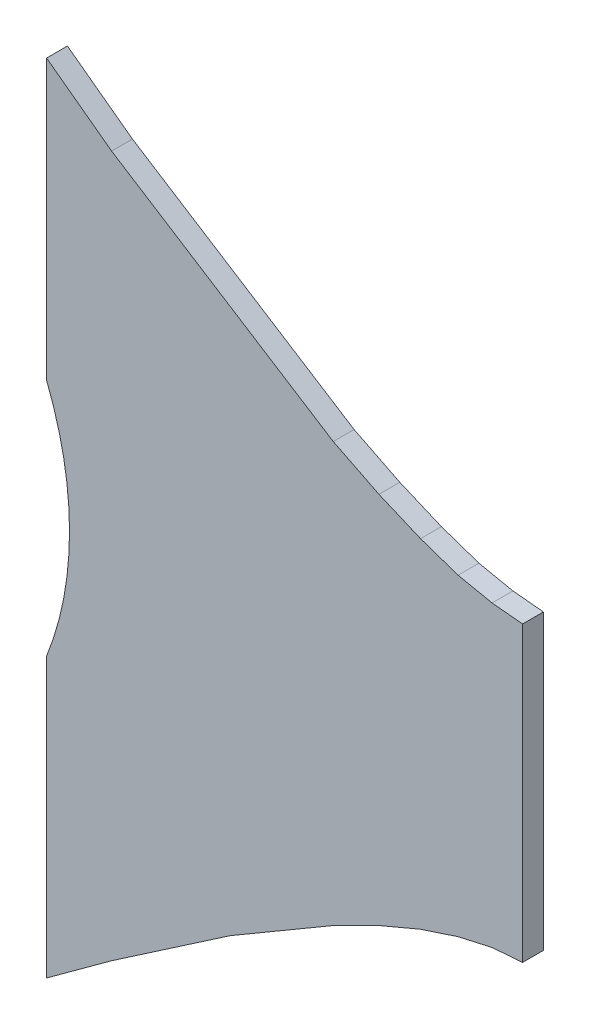
ISO-10303-21;
HEADER;
FILE_DESCRIPTION(('STEP AP214'),'2;1');
FILE_NAME('part.step','',(''),(''),'','','');
FILE_SCHEMA(('AUTOMOTIVE_DESIGN { 1 0 10303 214 1 1 1 1 }'));
ENDSEC;
DATA;
#1=APPLICATION_CONTEXT('core data for automotive mechanical design processes');
#2=APPLICATION_PROTOCOL_DEFINITION('international standard','automotive_design',2000,#1);
#3=PRODUCT_CONTEXT('',#1,'mechanical');
#4=PRODUCT('Part','Part','',(#3));
#5=PRODUCT_RELATED_PRODUCT_CATEGORY('part','',(#4));
#6=PRODUCT_DEFINITION_FORMATION('','',#4);
#7=PRODUCT_DEFINITION_CONTEXT('part definition',#1,'design');
#8=PRODUCT_DEFINITION('design','',#6,#7);
#9=PRODUCT_DEFINITION_SHAPE('','',#8);
#10=(LENGTH_UNIT() NAMED_UNIT(*) SI_UNIT(.MILLI.,.METRE.));
#11=(NAMED_UNIT(*) PLANE_ANGLE_UNIT() SI_UNIT($,.RADIAN.));
#12=(NAMED_UNIT(*) SI_UNIT($,.STERADIAN.) SOLID_ANGLE_UNIT());
#13=UNCERTAINTY_MEASURE_WITH_UNIT(LENGTH_MEASURE(1.E-05),#10,'distance_accuracy_value','');
#14=(GEOMETRIC_REPRESENTATION_CONTEXT(3) GLOBAL_UNCERTAINTY_ASSIGNED_CONTEXT((#13)) GLOBAL_UNIT_ASSIGNED_CONTEXT((#10,
#11,#12)) REPRESENTATION_CONTEXT('',''));
#15=CARTESIAN_POINT('',(0.,0.,0.));
#16=DIRECTION('',(0.,0.,1.));
#17=DIRECTION('',(1.,0.,0.));
#18=AXIS2_PLACEMENT_3D('',#15,#16,#17);
#19=CARTESIAN_POINT('',(98.0270004272461,52.6430015563965,0.));
#20=DIRECTION('',(-1.,0.,0.));
#21=DIRECTION('',(0.,1.,0.));
#22=AXIS2_PLACEMENT_3D('',#19,#20,#21);
#23=PLANE('',#22);
#24=DIRECTION('',(0.,1.,0.));
#25=VECTOR('',#24,1.);
#26=CARTESIAN_POINT('',(98.0270004272461,52.6430015563965,0.03556));
#27=LINE('',#26,#25);
#28=CARTESIAN_POINT('',(98.0270004272461,52.6430015563965,0.03556));
#29=VERTEX_POINT('',#28);
#30=CARTESIAN_POINT('',(98.0270004272461,53.1430015563965,0.03556));
#31=VERTEX_POINT('',#30);
#32=EDGE_CURVE('E11',#29,#31,#27,.T.);
#33=ORIENTED_EDGE('',*,*,#32,.F.);
#34=DIRECTION('',(0.,0.,1.));
#35=VECTOR('',#34,1.);
#36=CARTESIAN_POINT('',(98.0270004272461,52.6430015563965,0.));
#37=LINE('',#36,#35);
#38=CARTESIAN_POINT('',(98.0270004272461,52.6430015563965,0.));
#39=VERTEX_POINT('',#38);
#40=EDGE_CURVE('E24',#39,#29,#37,.T.);
#41=ORIENTED_EDGE('',*,*,#40,.F.);
#42=DIRECTION('',(0.,1.,0.));
#43=VECTOR('',#42,1.);
#44=CARTESIAN_POINT('',(98.0270004272461,52.6430015563965,0.));
#45=LINE('',#44,#43);
#46=CARTESIAN_POINT('',(98.0270004272461,53.1430015563965,0.));
#47=VERTEX_POINT('',#46);
#48=EDGE_CURVE('E309',#39,#47,#45,.T.);
#49=ORIENTED_EDGE('',*,*,#48,.T.);
#50=DIRECTION('',(0.,0.,1.));
#51=VECTOR('',#50,1.);
#52=CARTESIAN_POINT('',(98.0270004272461,53.1430015563965,0.));
#53=LINE('',#52,#51);
#54=EDGE_CURVE('E37',#47,#31,#53,.T.);
#55=ORIENTED_EDGE('',*,*,#54,.T.);
#56=EDGE_LOOP('',(#33,#41,#49,#55));
#57=FACE_BOUND('',#56,.T.);
#58=ADVANCED_FACE('F17',(#57),#23,.F.);
#59=CARTESIAN_POINT('',(97.9749984741211,52.6389999389648,0.));
#60=DIRECTION('',(-0.0767244643689744,0.997052333915976,0.));
#61=DIRECTION('',(0.997052333915976,0.0767244643689744,0.));
#62=AXIS2_PLACEMENT_3D('',#59,#60,#61);
#63=PLANE('',#62);
#64=DIRECTION('',(0.997052333915975,0.0767244643689743,0.));
#65=VECTOR('',#64,1.);
#66=CARTESIAN_POINT('',(97.9749984741211,52.6389999389648,0.03556));
#67=LINE('',#66,#65);
#68=CARTESIAN_POINT('',(97.9749984741211,52.6389999389648,0.03556));
#69=VERTEX_POINT('',#68);
#70=EDGE_CURVE('E305',#69,#29,#67,.T.);
#71=ORIENTED_EDGE('',*,*,#70,.F.);
#72=DIRECTION('',(0.,0.,1.));
#73=VECTOR('',#72,1.);
#74=CARTESIAN_POINT('',(97.9749984741211,52.6389999389648,0.));
#75=LINE('',#74,#73);
#76=CARTESIAN_POINT('',(97.9749984741211,52.6389999389648,0.));
#77=VERTEX_POINT('',#76);
#78=EDGE_CURVE('E303',#77,#69,#75,.T.);
#79=ORIENTED_EDGE('',*,*,#78,.F.);
#80=DIRECTION('',(0.997052333915975,0.0767244643689743,0.));
#81=VECTOR('',#80,1.);
#82=CARTESIAN_POINT('',(97.9749984741211,52.6389999389648,0.));
#83=LINE('',#82,#81);
#84=EDGE_CURVE('E301',#77,#39,#83,.T.);
#85=ORIENTED_EDGE('',*,*,#84,.T.);
#86=ORIENTED_EDGE('',*,*,#40,.T.);
#87=EDGE_LOOP('',(#71,#79,#85,#86));
#88=FACE_BOUND('',#87,.T.);
#89=ADVANCED_FACE('F312',(#88),#63,.F.);
#90=CARTESIAN_POINT('',(97.9169998168945,52.6259994506836,0.));
#91=DIRECTION('',(-0.218724100263412,0.97578674307656,0.));
#92=DIRECTION('',(0.97578674307656,0.218724100263412,0.));
#93=AXIS2_PLACEMENT_3D('',#90,#91,#92);
#94=PLANE('',#93);
#95=DIRECTION('',(0.97578674307656,0.218724100263412,0.));
#96=VECTOR('',#95,1.);
#97=CARTESIAN_POINT('',(97.9169998168945,52.6259994506836,0.03556));
#98=LINE('',#97,#96);
#99=CARTESIAN_POINT('',(97.9169998168945,52.6259994506836,0.03556));
#100=VERTEX_POINT('',#99);
#101=EDGE_CURVE('E298',#100,#69,#98,.T.);
#102=ORIENTED_EDGE('',*,*,#101,.F.);
#103=DIRECTION('',(0.,0.,1.));
#104=VECTOR('',#103,1.);
#105=CARTESIAN_POINT('',(97.9169998168945,52.6259994506836,0.));
#106=LINE('',#105,#104);
#107=CARTESIAN_POINT('',(97.9169998168945,52.6259994506836,0.));
#108=VERTEX_POINT('',#107);
#109=EDGE_CURVE('E296',#108,#100,#106,.T.);
#110=ORIENTED_EDGE('',*,*,#109,.F.);
#111=DIRECTION('',(0.97578674307656,0.218724100263412,0.));
#112=VECTOR('',#111,1.);
#113=CARTESIAN_POINT('',(97.9169998168945,52.6259994506836,0.));
#114=LINE('',#113,#112);
#115=EDGE_CURVE('E293',#108,#77,#114,.T.);
#116=ORIENTED_EDGE('',*,*,#115,.T.);
#117=ORIENTED_EDGE('',*,*,#78,.T.);
#118=EDGE_LOOP('',(#102,#110,#116,#117));
#119=FACE_BOUND('',#118,.T.);
#120=ADVANCED_FACE('F315',(#119),#94,.F.);
#121=CARTESIAN_POINT('',(97.8529968261719,52.6049995422363,0.));
#122=DIRECTION('',(-0.311756038445527,0.950162182205097,0.));
#123=DIRECTION('',(0.950162182205097,0.311756038445527,0.));
#124=AXIS2_PLACEMENT_3D('',#121,#122,#123);
#125=PLANE('',#124);
#126=DIRECTION('',(0.950162182205097,0.311756038445527,0.));
#127=VECTOR('',#126,1.);
#128=CARTESIAN_POINT('',(97.8529968261719,52.6049995422363,0.03556));
#129=LINE('',#128,#127);
#130=CARTESIAN_POINT('',(97.8529968261719,52.6049995422363,0.03556));
#131=VERTEX_POINT('',#130);
#132=EDGE_CURVE('E290',#131,#100,#129,.T.);
#133=ORIENTED_EDGE('',*,*,#132,.F.);
#134=DIRECTION('',(0.,0.,1.));
#135=VECTOR('',#134,1.);
#136=CARTESIAN_POINT('',(97.8529968261719,52.6049995422363,0.));
#137=LINE('',#136,#135);
#138=CARTESIAN_POINT('',(97.8529968261719,52.6049995422363,0.));
#139=VERTEX_POINT('',#138);
#140=EDGE_CURVE('E288',#139,#131,#137,.T.);
#141=ORIENTED_EDGE('',*,*,#140,.F.);
#142=DIRECTION('',(0.950162182205097,0.311756038445527,0.));
#143=VECTOR('',#142,1.);
#144=CARTESIAN_POINT('',(97.8529968261719,52.6049995422363,0.));
#145=LINE('',#144,#143);
#146=EDGE_CURVE('E285',#139,#108,#145,.T.);
#147=ORIENTED_EDGE('',*,*,#146,.T.);
#148=ORIENTED_EDGE('',*,*,#109,.T.);
#149=EDGE_LOOP('',(#133,#141,#147,#148));
#150=FACE_BOUND('',#149,.T.);
#151=ADVANCED_FACE('F320',(#150),#125,.F.);
#152=CARTESIAN_POINT('',(97.7819976806641,52.5750007629395,0.));
#153=DIRECTION('',(-0.389207247493552,0.921150214947862,0.));
#154=DIRECTION('',(0.921150214947862,0.389207247493552,0.));
#155=AXIS2_PLACEMENT_3D('',#152,#153,#154);
#156=PLANE('',#155);
#157=DIRECTION('',(0.921150214947862,0.389207247493552,0.));
#158=VECTOR('',#157,1.);
#159=CARTESIAN_POINT('',(97.7819976806641,52.5750007629395,0.03556));
#160=LINE('',#159,#158);
#161=CARTESIAN_POINT('',(97.7819976806641,52.5750007629395,0.03556));
#162=VERTEX_POINT('',#161);
#163=EDGE_CURVE('E282',#162,#131,#160,.T.);
#164=ORIENTED_EDGE('',*,*,#163,.F.);
#165=DIRECTION('',(0.,0.,1.));
#166=VECTOR('',#165,1.);
#167=CARTESIAN_POINT('',(97.7819976806641,52.5750007629395,0.));
#168=LINE('',#167,#166);
#169=CARTESIAN_POINT('',(97.7819976806641,52.5750007629395,0.));
#170=VERTEX_POINT('',#169);
#171=EDGE_CURVE('E280',#170,#162,#168,.T.);
#172=ORIENTED_EDGE('',*,*,#171,.F.);
#173=DIRECTION('',(0.921150214947862,0.389207247493552,0.));
#174=VECTOR('',#173,1.);
#175=CARTESIAN_POINT('',(97.7819976806641,52.5750007629395,0.));
#176=LINE('',#175,#174);
#177=EDGE_CURVE('E277',#170,#139,#176,.T.);
#178=ORIENTED_EDGE('',*,*,#177,.T.);
#179=ORIENTED_EDGE('',*,*,#140,.T.);
#180=EDGE_LOOP('',(#164,#172,#178,#179));
#181=FACE_BOUND('',#180,.T.);
#182=ADVANCED_FACE('F323',(#181),#156,.F.);
#183=CARTESIAN_POINT('',(97.7040023803711,52.5359992980957,0.));
#184=DIRECTION('',(-0.447248591135036,0.894409692326579,0.));
#185=DIRECTION('',(0.894409692326579,0.447248591135036,0.));
#186=AXIS2_PLACEMENT_3D('',#183,#184,#185);
#187=PLANE('',#186);
#188=DIRECTION('',(0.894409692326579,0.447248591135036,0.));
#189=VECTOR('',#188,1.);
#190=CARTESIAN_POINT('',(97.7040023803711,52.5359992980957,0.03556));
#191=LINE('',#190,#189);
#192=CARTESIAN_POINT('',(97.7040023803711,52.5359992980957,0.03556));
#193=VERTEX_POINT('',#192);
#194=EDGE_CURVE('E274',#193,#162,#191,.T.);
#195=ORIENTED_EDGE('',*,*,#194,.F.);
#196=DIRECTION('',(0.,0.,1.));
#197=VECTOR('',#196,1.);
#198=CARTESIAN_POINT('',(97.7040023803711,52.5359992980957,0.));
#199=LINE('',#198,#197);
#200=CARTESIAN_POINT('',(97.7040023803711,52.5359992980957,0.));
#201=VERTEX_POINT('',#200);
#202=EDGE_CURVE('E272',#201,#193,#199,.T.);
#203=ORIENTED_EDGE('',*,*,#202,.F.);
#204=DIRECTION('',(0.894409692326579,0.447248591135036,0.));
#205=VECTOR('',#204,1.);
#206=CARTESIAN_POINT('',(97.7040023803711,52.5359992980957,0.));
#207=LINE('',#206,#205);
#208=EDGE_CURVE('E269',#201,#170,#207,.T.);
#209=ORIENTED_EDGE('',*,*,#208,.T.);
#210=ORIENTED_EDGE('',*,*,#171,.T.);
#211=EDGE_LOOP('',(#195,#203,#209,#210));
#212=FACE_BOUND('',#211,.T.);
#213=ADVANCED_FACE('F328',(#212),#187,.F.);
#214=CARTESIAN_POINT('',(97.5279998779297,52.4329986572266,0.));
#215=DIRECTION('',(-0.50508710963613,0.86306837022302,0.));
#216=DIRECTION('',(0.86306837022302,0.50508710963613,0.));
#217=AXIS2_PLACEMENT_3D('',#214,#215,#216);
#218=PLANE('',#217);
#219=DIRECTION('',(0.86306837022302,0.50508710963613,0.));
#220=VECTOR('',#219,1.);
#221=CARTESIAN_POINT('',(97.5279998779297,52.4329986572266,0.03556));
#222=LINE('',#221,#220);
#223=CARTESIAN_POINT('',(97.5279998779297,52.4329986572266,0.03556));
#224=VERTEX_POINT('',#223);
#225=EDGE_CURVE('E266',#224,#193,#222,.T.);
#226=ORIENTED_EDGE('',*,*,#225,.F.);
#227=DIRECTION('',(0.,0.,1.));
#228=VECTOR('',#227,1.);
#229=CARTESIAN_POINT('',(97.5279998779297,52.4329986572266,0.));
#230=LINE('',#229,#228);
#231=CARTESIAN_POINT('',(97.5279998779297,52.4329986572266,0.));
#232=VERTEX_POINT('',#231);
#233=EDGE_CURVE('E264',#232,#224,#230,.T.);
#234=ORIENTED_EDGE('',*,*,#233,.F.);
#235=DIRECTION('',(0.86306837022302,0.50508710963613,0.));
#236=VECTOR('',#235,1.);
#237=CARTESIAN_POINT('',(97.5279998779297,52.4329986572266,0.));
#238=LINE('',#237,#236);
#239=EDGE_CURVE('E261',#232,#201,#238,.T.);
#240=ORIENTED_EDGE('',*,*,#239,.T.);
#241=ORIENTED_EDGE('',*,*,#202,.T.);
#242=EDGE_LOOP('',(#226,#234,#240,#241));
#243=FACE_BOUND('',#242,.T.);
#244=ADVANCED_FACE('F331',(#243),#218,.F.);
#245=CARTESIAN_POINT('',(97.3259963989258,52.2949981689453,0.));
#246=DIRECTION('',(-0.564092354607305,0.825711702395931,0.));
#247=DIRECTION('',(0.825711702395931,0.564092354607305,0.));
#248=AXIS2_PLACEMENT_3D('',#245,#246,#247);
#249=PLANE('',#248);
#250=DIRECTION('',(0.825711702395931,0.564092354607305,0.));
#251=VECTOR('',#250,1.);
#252=CARTESIAN_POINT('',(97.3259963989258,52.2949981689453,0.03556));
#253=LINE('',#252,#251);
#254=CARTESIAN_POINT('',(97.3259963989258,52.2949981689453,0.03556));
#255=VERTEX_POINT('',#254);
#256=EDGE_CURVE('E258',#255,#224,#253,.T.);
#257=ORIENTED_EDGE('',*,*,#256,.F.);
#258=DIRECTION('',(0.,0.,1.));
#259=VECTOR('',#258,1.);
#260=CARTESIAN_POINT('',(97.3259963989258,52.2949981689453,0.));
#261=LINE('',#260,#259);
#262=CARTESIAN_POINT('',(97.3259963989258,52.2949981689453,0.));
#263=VERTEX_POINT('',#262);
#264=EDGE_CURVE('E256',#263,#255,#261,.T.);
#265=ORIENTED_EDGE('',*,*,#264,.F.);
#266=DIRECTION('',(0.825711702395931,0.564092354607305,0.));
#267=VECTOR('',#266,1.);
#268=CARTESIAN_POINT('',(97.3259963989258,52.2949981689453,0.));
#269=LINE('',#268,#267);
#270=EDGE_CURVE('E253',#263,#232,#269,.T.);
#271=ORIENTED_EDGE('',*,*,#270,.T.);
#272=ORIENTED_EDGE('',*,*,#233,.T.);
#273=EDGE_LOOP('',(#257,#265,#271,#272));
#274=FACE_BOUND('',#273,.T.);
#275=ADVANCED_FACE('F336',(#274),#249,.F.);
#276=CARTESIAN_POINT('',(97.2149963378906,52.2140007019043,0.));
#277=DIRECTION('',(-0.589456830119267,0.80779987956532,0.));
#278=DIRECTION('',(0.80779987956532,0.589456830119267,0.));
#279=AXIS2_PLACEMENT_3D('',#276,#277,#278);
#280=PLANE('',#279);
#281=DIRECTION('',(0.80779987956532,0.589456830119267,0.));
#282=VECTOR('',#281,1.);
#283=CARTESIAN_POINT('',(97.2149963378906,52.2140007019043,0.03556));
#284=LINE('',#283,#282);
#285=CARTESIAN_POINT('',(97.2149963378906,52.2140007019043,0.03556));
#286=VERTEX_POINT('',#285);
#287=EDGE_CURVE('E250',#286,#255,#284,.T.);
#288=ORIENTED_EDGE('',*,*,#287,.F.);
#289=DIRECTION('',(0.,0.,1.));
#290=VECTOR('',#289,1.);
#291=CARTESIAN_POINT('',(97.2149963378906,52.2140007019043,0.));
#292=LINE('',#291,#290);
#293=CARTESIAN_POINT('',(97.2149963378906,52.2140007019043,0.));
#294=VERTEX_POINT('',#293);
#295=EDGE_CURVE('E248',#294,#286,#292,.T.);
#296=ORIENTED_EDGE('',*,*,#295,.F.);
#297=DIRECTION('',(0.80779987956532,0.589456830119267,0.));
#298=VECTOR('',#297,1.);
#299=CARTESIAN_POINT('',(97.2149963378906,52.2140007019043,0.));
#300=LINE('',#299,#298);
#301=EDGE_CURVE('E245',#294,#263,#300,.T.);
#302=ORIENTED_EDGE('',*,*,#301,.T.);
#303=ORIENTED_EDGE('',*,*,#264,.T.);
#304=EDGE_LOOP('',(#288,#296,#302,#303));
#305=FACE_BOUND('',#304,.T.);
#306=ADVANCED_FACE('F339',(#305),#280,.F.);
#307=CARTESIAN_POINT('',(97.2149963378906,52.6894638945434,0.));
#308=DIRECTION('',(1.,0.,0.));
#309=DIRECTION('',(0.,-1.,0.));
#310=AXIS2_PLACEMENT_3D('',#307,#308,#309);
#311=PLANE('',#310);
#312=DIRECTION('',(0.,-1.,0.));
#313=VECTOR('',#312,1.);
#314=CARTESIAN_POINT('',(97.2149963378906,53.5730018615723,0.03556));
#315=LINE('',#314,#313);
#316=CARTESIAN_POINT('',(97.2149963378906,52.6894638945433,0.03556));
#317=VERTEX_POINT('',#316);
#318=EDGE_CURVE('E242',#317,#286,#315,.T.);
#319=ORIENTED_EDGE('',*,*,#318,.F.);
#320=DIRECTION('',(0.,0.,1.));
#321=VECTOR('',#320,1.);
#322=CARTESIAN_POINT('',(97.2149963378906,52.6894638945433,0.));
#323=LINE('',#322,#321);
#324=CARTESIAN_POINT('',(97.2149963378906,52.6894638945433,0.));
#325=VERTEX_POINT('',#324);
#326=EDGE_CURVE('E240',#325,#317,#323,.T.);
#327=ORIENTED_EDGE('',*,*,#326,.F.);
#328=DIRECTION('',(0.,-1.,0.));
#329=VECTOR('',#328,1.);
#330=CARTESIAN_POINT('',(97.2149963378906,53.5730018615723,0.));
#331=LINE('',#330,#329);
#332=EDGE_CURVE('E237',#325,#294,#331,.T.);
#333=ORIENTED_EDGE('',*,*,#332,.T.);
#334=ORIENTED_EDGE('',*,*,#295,.T.);
#335=EDGE_LOOP('',(#319,#327,#333,#334));
#336=FACE_BOUND('',#335,.T.);
#337=ADVANCED_FACE('F344',(#336),#311,.F.);
#338=CARTESIAN_POINT('',(96.70415,52.8932648,0.));
#339=DIRECTION('',(0.,0.,-1.));
#340=DIRECTION('',(1.,0.,0.));
#341=AXIS2_PLACEMENT_3D('',#338,#339,#340);
#342=CYLINDRICAL_SURFACE('',#341,0.5499989);
#343=ORIENTED_EDGE('',*,*,#326,.T.);
#344=CARTESIAN_POINT('',(96.70415,52.8932648,0.03556));
#345=DIRECTION('',(0.,0.,1.));
#346=DIRECTION('',(1.,0.,0.));
#347=AXIS2_PLACEMENT_3D('',#344,#345,#346);
#348=CIRCLE('',#347,0.5499989);
#349=CARTESIAN_POINT('',(97.2541489,52.8932648,0.03556));
#350=VERTEX_POINT('',#349);
#351=EDGE_CURVE('E234',#317,#350,#348,.T.);
#352=ORIENTED_EDGE('',*,*,#351,.T.);
#353=DIRECTION('',(0.,0.,1.));
#354=VECTOR('',#353,1.);
#355=CARTESIAN_POINT('',(97.2541489,52.8932648,0.));
#356=LINE('',#355,#354);
#357=CARTESIAN_POINT('',(97.2541489,52.8932648,0.));
#358=VERTEX_POINT('',#357);
#359=EDGE_CURVE('E232',#358,#350,#356,.T.);
#360=ORIENTED_EDGE('',*,*,#359,.F.);
#361=CARTESIAN_POINT('',(96.70415,52.8932648,0.));
#362=DIRECTION('',(0.,0.,1.));
#363=DIRECTION('',(1.,0.,0.));
#364=AXIS2_PLACEMENT_3D('',#361,#362,#363);
#365=CIRCLE('',#364,0.5499989);
#366=EDGE_CURVE('E229',#325,#358,#365,.T.);
#367=ORIENTED_EDGE('',*,*,#366,.F.);
#368=EDGE_LOOP('',(#343,#352,#360,#367));
#369=FACE_BOUND('',#368,.T.);
#370=ADVANCED_FACE('F347',(#369),#342,.F.);
#371=CARTESIAN_POINT('',(96.70415,52.8932648,0.));
#372=DIRECTION('',(0.,0.,-1.));
#373=DIRECTION('',(1.,0.,0.));
#374=AXIS2_PLACEMENT_3D('',#371,#372,#373);
#375=CYLINDRICAL_SURFACE('',#374,0.5499989);
#376=ORIENTED_EDGE('',*,*,#359,.T.);
#377=CARTESIAN_POINT('',(96.70415,52.8932648,0.03556));
#378=DIRECTION('',(0.,0.,1.));
#379=DIRECTION('',(1.,0.,0.));
#380=AXIS2_PLACEMENT_3D('',#377,#378,#379);
#381=CIRCLE('',#380,0.5499989);
#382=CARTESIAN_POINT('',(97.2149963378906,53.0970657054566,0.03556));
#383=VERTEX_POINT('',#382);
#384=EDGE_CURVE('E226',#350,#383,#381,.T.);
#385=ORIENTED_EDGE('',*,*,#384,.T.);
#386=DIRECTION('',(0.,0.,1.));
#387=VECTOR('',#386,1.);
#388=CARTESIAN_POINT('',(97.2149963378906,53.0970657054566,0.));
#389=LINE('',#388,#387);
#390=CARTESIAN_POINT('',(97.2149963378906,53.0970657054566,0.));
#391=VERTEX_POINT('',#390);
#392=EDGE_CURVE('E224',#391,#383,#389,.T.);
#393=ORIENTED_EDGE('',*,*,#392,.F.);
#394=EDGE_CURVE('E223',#358,#391,#365,.T.);
#395=ORIENTED_EDGE('',*,*,#394,.F.);
#396=EDGE_LOOP('',(#376,#385,#393,#395));
#397=FACE_BOUND('',#396,.T.);
#398=ADVANCED_FACE('F354',(#397),#375,.F.);
#399=CARTESIAN_POINT('',(97.2149963378906,53.5730018615723,0.));
#400=DIRECTION('',(1.,0.,0.));
#401=DIRECTION('',(0.,-1.,0.));
#402=AXIS2_PLACEMENT_3D('',#399,#400,#401);
#403=PLANE('',#402);
#404=DIRECTION('',(0.,-1.,0.));
#405=VECTOR('',#404,1.);
#406=CARTESIAN_POINT('',(97.2149963378906,53.5730018615723,0.03556));
#407=LINE('',#406,#405);
#408=CARTESIAN_POINT('',(97.2149963378906,53.5730018615723,0.03556));
#409=VERTEX_POINT('',#408);
#410=EDGE_CURVE('E220',#409,#383,#407,.T.);
#411=ORIENTED_EDGE('',*,*,#410,.F.);
#412=DIRECTION('',(0.,0.,1.));
#413=VECTOR('',#412,1.);
#414=CARTESIAN_POINT('',(97.2149963378906,53.5730018615723,0.));
#415=LINE('',#414,#413);
#416=CARTESIAN_POINT('',(97.2149963378906,53.5730018615723,0.));
#417=VERTEX_POINT('',#416);
#418=EDGE_CURVE('E218',#417,#409,#415,.T.);
#419=ORIENTED_EDGE('',*,*,#418,.F.);
#420=EDGE_CURVE('E217',#417,#391,#331,.T.);
#421=ORIENTED_EDGE('',*,*,#420,.T.);
#422=ORIENTED_EDGE('',*,*,#392,.T.);
#423=EDGE_LOOP('',(#411,#419,#421,#422));
#424=FACE_BOUND('',#423,.T.);
#425=ADVANCED_FACE('F357',(#424),#403,.F.);
#426=CARTESIAN_POINT('',(97.3259963989258,53.4910011291504,0.));
#427=DIRECTION('',(-0.594190520477867,-0.804324328473435,0.));
#428=DIRECTION('',(-0.804324328473435,0.594190520477867,0.));
#429=AXIS2_PLACEMENT_3D('',#426,#427,#428);
#430=PLANE('',#429);
#431=DIRECTION('',(-0.804324328473435,0.594190520477867,0.));
#432=VECTOR('',#431,1.);
#433=CARTESIAN_POINT('',(97.3259963989258,53.4910011291504,0.03556));
#434=LINE('',#433,#432);
#435=CARTESIAN_POINT('',(97.3259963989258,53.4910011291504,0.03556));
#436=VERTEX_POINT('',#435);
#437=EDGE_CURVE('E214',#436,#409,#434,.T.);
#438=ORIENTED_EDGE('',*,*,#437,.F.);
#439=DIRECTION('',(0.,0.,1.));
#440=VECTOR('',#439,1.);
#441=CARTESIAN_POINT('',(97.3259963989258,53.4910011291504,0.));
#442=LINE('',#441,#440);
#443=CARTESIAN_POINT('',(97.3259963989258,53.4910011291504,0.));
#444=VERTEX_POINT('',#443);
#445=EDGE_CURVE('E212',#444,#436,#442,.T.);
#446=ORIENTED_EDGE('',*,*,#445,.F.);
#447=DIRECTION('',(-0.804324328473435,0.594190520477867,0.));
#448=VECTOR('',#447,1.);
#449=CARTESIAN_POINT('',(97.3259963989258,53.4910011291504,0.));
#450=LINE('',#449,#448);
#451=EDGE_CURVE('E209',#444,#417,#450,.T.);
#452=ORIENTED_EDGE('',*,*,#451,.T.);
#453=ORIENTED_EDGE('',*,*,#418,.T.);
#454=EDGE_LOOP('',(#438,#446,#452,#453));
#455=FACE_BOUND('',#454,.T.);
#456=ADVANCED_FACE('F362',(#455),#430,.F.);
#457=CARTESIAN_POINT('',(97.7040023803711,53.2509994506836,0.));
#458=DIRECTION('',(-0.536004763432002,-0.844214956973758,0.));
#459=DIRECTION('',(-0.844214956973758,0.536004763432002,0.));
#460=AXIS2_PLACEMENT_3D('',#457,#458,#459);
#461=PLANE('',#460);
#462=DIRECTION('',(-0.844214956973758,0.536004763432002,0.));
#463=VECTOR('',#462,1.);
#464=CARTESIAN_POINT('',(97.7040023803711,53.2509994506836,0.03556));
#465=LINE('',#464,#463);
#466=CARTESIAN_POINT('',(97.7040023803711,53.2509994506836,0.03556));
#467=VERTEX_POINT('',#466);
#468=EDGE_CURVE('E206',#467,#436,#465,.T.);
#469=ORIENTED_EDGE('',*,*,#468,.F.);
#470=DIRECTION('',(0.,0.,1.));
#471=VECTOR('',#470,1.);
#472=CARTESIAN_POINT('',(97.7040023803711,53.2509994506836,0.));
#473=LINE('',#472,#471);
#474=CARTESIAN_POINT('',(97.7040023803711,53.2509994506836,0.));
#475=VERTEX_POINT('',#474);
#476=EDGE_CURVE('E204',#475,#467,#473,.T.);
#477=ORIENTED_EDGE('',*,*,#476,.F.);
#478=DIRECTION('',(-0.844214956973758,0.536004763432002,0.));
#479=VECTOR('',#478,1.);
#480=CARTESIAN_POINT('',(97.7040023803711,53.2509994506836,0.));
#481=LINE('',#480,#479);
#482=EDGE_CURVE('E201',#475,#444,#481,.T.);
#483=ORIENTED_EDGE('',*,*,#482,.T.);
#484=ORIENTED_EDGE('',*,*,#445,.T.);
#485=EDGE_LOOP('',(#469,#477,#483,#484));
#486=FACE_BOUND('',#485,.T.);
#487=ADVANCED_FACE('F365',(#486),#461,.F.);
#488=CARTESIAN_POINT('',(97.7819976806641,53.2120018005371,0.));
#489=DIRECTION('',(-0.447213595499958,-0.894427190999916,0.));
#490=DIRECTION('',(-0.894427190999916,0.447213595499958,0.));
#491=AXIS2_PLACEMENT_3D('',#488,#489,#490);
#492=PLANE('',#491);
#493=DIRECTION('',(-0.894427190999916,0.447213595499958,0.));
#494=VECTOR('',#493,1.);
#495=CARTESIAN_POINT('',(97.7819976806641,53.2120018005371,0.03556));
#496=LINE('',#495,#494);
#497=CARTESIAN_POINT('',(97.7819976806641,53.2120018005371,0.03556));
#498=VERTEX_POINT('',#497);
#499=EDGE_CURVE('E198',#498,#467,#496,.T.);
#500=ORIENTED_EDGE('',*,*,#499,.F.);
#501=DIRECTION('',(0.,0.,1.));
#502=VECTOR('',#501,1.);
#503=CARTESIAN_POINT('',(97.7819976806641,53.2120018005371,0.));
#504=LINE('',#503,#502);
#505=CARTESIAN_POINT('',(97.7819976806641,53.2120018005371,0.));
#506=VERTEX_POINT('',#505);
#507=EDGE_CURVE('E196',#506,#498,#504,.T.);
#508=ORIENTED_EDGE('',*,*,#507,.F.);
#509=DIRECTION('',(-0.894427190999916,0.447213595499958,0.));
#510=VECTOR('',#509,1.);
#511=CARTESIAN_POINT('',(97.7819976806641,53.2120018005371,0.));
#512=LINE('',#511,#510);
#513=EDGE_CURVE('E193',#506,#475,#512,.T.);
#514=ORIENTED_EDGE('',*,*,#513,.T.);
#515=ORIENTED_EDGE('',*,*,#476,.T.);
#516=EDGE_LOOP('',(#500,#508,#514,#515));
#517=FACE_BOUND('',#516,.T.);
#518=ADVANCED_FACE('F369',(#517),#492,.F.);
#519=CARTESIAN_POINT('',(97.8529968261719,53.181999206543,0.));
#520=DIRECTION('',(-0.38924924135206,-0.921132470444315,0.));
#521=DIRECTION('',(-0.921132470444315,0.38924924135206,0.));
#522=AXIS2_PLACEMENT_3D('',#519,#520,#521);
#523=PLANE('',#522);
#524=DIRECTION('',(-0.921132470444314,0.38924924135206,0.));
#525=VECTOR('',#524,1.);
#526=CARTESIAN_POINT('',(97.8529968261719,53.181999206543,0.03556));
#527=LINE('',#526,#525);
#528=CARTESIAN_POINT('',(97.8529968261719,53.181999206543,0.03556));
#529=VERTEX_POINT('',#528);
#530=EDGE_CURVE('E190',#529,#498,#527,.T.);
#531=ORIENTED_EDGE('',*,*,#530,.F.);
#532=DIRECTION('',(0.,0.,1.));
#533=VECTOR('',#532,1.);
#534=CARTESIAN_POINT('',(97.8529968261719,53.181999206543,0.));
#535=LINE('',#534,#533);
#536=CARTESIAN_POINT('',(97.8529968261719,53.181999206543,0.));
#537=VERTEX_POINT('',#536);
#538=EDGE_CURVE('E188',#537,#529,#535,.T.);
#539=ORIENTED_EDGE('',*,*,#538,.F.);
#540=DIRECTION('',(-0.921132470444314,0.38924924135206,0.));
#541=VECTOR('',#540,1.);
#542=CARTESIAN_POINT('',(97.8529968261719,53.181999206543,0.));
#543=LINE('',#542,#541);
#544=EDGE_CURVE('E185',#537,#506,#543,.T.);
#545=ORIENTED_EDGE('',*,*,#544,.T.);
#546=ORIENTED_EDGE('',*,*,#507,.T.);
#547=EDGE_LOOP('',(#531,#539,#545,#546));
#548=FACE_BOUND('',#547,.T.);
#549=ADVANCED_FACE('F372',(#548),#523,.F.);
#550=CARTESIAN_POINT('',(97.9169998168945,53.1599998474121,0.));
#551=DIRECTION('',(-0.325057714641856,-0.945694180034864,0.));
#552=DIRECTION('',(-0.945694180034864,0.325057714641856,0.));
#553=AXIS2_PLACEMENT_3D('',#550,#551,#552);
#554=PLANE('',#553);
#555=DIRECTION('',(-0.945694180034864,0.325057714641856,0.));
#556=VECTOR('',#555,1.);
#557=CARTESIAN_POINT('',(97.9169998168945,53.1599998474121,0.03556));
#558=LINE('',#557,#556);
#559=CARTESIAN_POINT('',(97.9169998168945,53.1599998474121,0.03556));
#560=VERTEX_POINT('',#559);
#561=EDGE_CURVE('E182',#560,#529,#558,.T.);
#562=ORIENTED_EDGE('',*,*,#561,.F.);
#563=DIRECTION('',(0.,0.,1.));
#564=VECTOR('',#563,1.);
#565=CARTESIAN_POINT('',(97.9169998168945,53.1599998474121,0.));
#566=LINE('',#565,#564);
#567=CARTESIAN_POINT('',(97.9169998168945,53.1599998474121,0.));
#568=VERTEX_POINT('',#567);
#569=EDGE_CURVE('E180',#568,#560,#566,.T.);
#570=ORIENTED_EDGE('',*,*,#569,.F.);
#571=DIRECTION('',(-0.945694180034864,0.325057714641856,0.));
#572=VECTOR('',#571,1.);
#573=CARTESIAN_POINT('',(97.9169998168945,53.1599998474121,0.));
#574=LINE('',#573,#572);
#575=EDGE_CURVE('E171',#568,#537,#574,.T.);
#576=ORIENTED_EDGE('',*,*,#575,.T.);
#577=ORIENTED_EDGE('',*,*,#538,.T.);
#578=EDGE_LOOP('',(#562,#570,#576,#577));
#579=FACE_BOUND('',#578,.T.);
#580=ADVANCED_FACE('F375',(#579),#554,.F.);
#581=CARTESIAN_POINT('',(97.9749984741211,53.1479988098144,0.));
#582=DIRECTION('',(-0.202626901888374,-0.97925601281336,0.));
#583=DIRECTION('',(-0.97925601281336,0.202626901888374,0.));
#584=AXIS2_PLACEMENT_3D('',#581,#582,#583);
#585=PLANE('',#584);
#586=DIRECTION('',(-0.97925601281336,0.202626901888374,0.));
#587=VECTOR('',#586,1.);
#588=CARTESIAN_POINT('',(97.9749984741211,53.1479988098144,0.03556));
#589=LINE('',#588,#587);
#590=CARTESIAN_POINT('',(97.9749984741211,53.1479988098144,0.03556));
#591=VERTEX_POINT('',#590);
#592=EDGE_CURVE('E157',#591,#560,#589,.T.);
#593=ORIENTED_EDGE('',*,*,#592,.F.);
#594=DIRECTION('',(0.,0.,1.));
#595=VECTOR('',#594,1.);
#596=CARTESIAN_POINT('',(97.9749984741211,53.1479988098144,0.));
#597=LINE('',#596,#595);
#598=CARTESIAN_POINT('',(97.9749984741211,53.1479988098144,0.));
#599=VERTEX_POINT('',#598);
#600=EDGE_CURVE('E152',#599,#591,#597,.T.);
#601=ORIENTED_EDGE('',*,*,#600,.F.);
#602=DIRECTION('',(-0.97925601281336,0.202626901888374,0.));
#603=VECTOR('',#602,1.);
#604=CARTESIAN_POINT('',(97.9749984741211,53.1479988098144,0.));
#605=LINE('',#604,#603);
#606=EDGE_CURVE('E155',#599,#568,#605,.T.);
#607=ORIENTED_EDGE('',*,*,#606,.T.);
#608=ORIENTED_EDGE('',*,*,#569,.T.);
#609=EDGE_LOOP('',(#593,#601,#607,#608));
#610=FACE_BOUND('',#609,.T.);
#611=ADVANCED_FACE('F154',(#610),#585,.F.);
#612=CARTESIAN_POINT('',(98.0270004272461,53.1430015563965,0.));
#613=DIRECTION('',(-0.0956567515017381,-0.995414378986025,0.));
#614=DIRECTION('',(-0.995414378986025,0.0956567515017381,0.));
#615=AXIS2_PLACEMENT_3D('',#612,#613,#614);
#616=PLANE('',#615);
#617=DIRECTION('',(-0.995414378986025,0.0956567515017381,0.));
#618=VECTOR('',#617,1.);
#619=CARTESIAN_POINT('',(98.0270004272461,53.1430015563965,0.03556));
#620=LINE('',#619,#618);
#621=EDGE_CURVE('E172',#31,#591,#620,.T.);
#622=ORIENTED_EDGE('',*,*,#621,.F.);
#623=ORIENTED_EDGE('',*,*,#54,.F.);
#624=DIRECTION('',(-0.995414378986025,0.0956567515017381,0.));
#625=VECTOR('',#624,1.);
#626=CARTESIAN_POINT('',(98.0270004272461,53.1430015563965,0.));
#627=LINE('',#626,#625);
#628=EDGE_CURVE('E168',#47,#599,#627,.T.);
#629=ORIENTED_EDGE('',*,*,#628,.T.);
#630=ORIENTED_EDGE('',*,*,#600,.T.);
#631=EDGE_LOOP('',(#622,#623,#629,#630));
#632=FACE_BOUND('',#631,.T.);
#633=ADVANCED_FACE('F174',(#632),#616,.F.);
#634=CARTESIAN_POINT('',(98.0270004272461,53.1430015563965,0.));
#635=DIRECTION('',(0.,0.,1.));
#636=DIRECTION('',(1.,0.,0.));
#637=AXIS2_PLACEMENT_3D('',#634,#635,#636);
#638=PLANE('',#637);
#639=ORIENTED_EDGE('',*,*,#628,.F.);
#640=ORIENTED_EDGE('',*,*,#48,.F.);
#641=ORIENTED_EDGE('',*,*,#84,.F.);
#642=ORIENTED_EDGE('',*,*,#115,.F.);
#643=ORIENTED_EDGE('',*,*,#146,.F.);
#644=ORIENTED_EDGE('',*,*,#177,.F.);
#645=ORIENTED_EDGE('',*,*,#208,.F.);
#646=ORIENTED_EDGE('',*,*,#239,.F.);
#647=ORIENTED_EDGE('',*,*,#270,.F.);
#648=ORIENTED_EDGE('',*,*,#301,.F.);
#649=ORIENTED_EDGE('',*,*,#332,.F.);
#650=ORIENTED_EDGE('',*,*,#366,.T.);
#651=ORIENTED_EDGE('',*,*,#394,.T.);
#652=ORIENTED_EDGE('',*,*,#420,.F.);
#653=ORIENTED_EDGE('',*,*,#451,.F.);
#654=ORIENTED_EDGE('',*,*,#482,.F.);
#655=ORIENTED_EDGE('',*,*,#513,.F.);
#656=ORIENTED_EDGE('',*,*,#544,.F.);
#657=ORIENTED_EDGE('',*,*,#575,.F.);
#658=ORIENTED_EDGE('',*,*,#606,.F.);
#659=EDGE_LOOP('',(#639,#640,#641,#642,#643,#644,#645,#646,#647,#648,#649,#650,#651,#652,#653,
#654,#655,#656,#657,#658));
#660=FACE_BOUND('',#659,.T.);
#661=ADVANCED_FACE('F166',(#660),#638,.F.);
#662=CARTESIAN_POINT('',(98.0270004272461,53.1430015563965,0.03556));
#663=DIRECTION('',(0.,0.,1.));
#664=DIRECTION('',(1.,0.,0.));
#665=AXIS2_PLACEMENT_3D('',#662,#663,#664);
#666=PLANE('',#665);
#667=ORIENTED_EDGE('',*,*,#32,.T.);
#668=ORIENTED_EDGE('',*,*,#621,.T.);
#669=ORIENTED_EDGE('',*,*,#592,.T.);
#670=ORIENTED_EDGE('',*,*,#561,.T.);
#671=ORIENTED_EDGE('',*,*,#530,.T.);
#672=ORIENTED_EDGE('',*,*,#499,.T.);
#673=ORIENTED_EDGE('',*,*,#468,.T.);
#674=ORIENTED_EDGE('',*,*,#437,.T.);
#675=ORIENTED_EDGE('',*,*,#410,.T.);
#676=ORIENTED_EDGE('',*,*,#384,.F.);
#677=ORIENTED_EDGE('',*,*,#351,.F.);
#678=ORIENTED_EDGE('',*,*,#318,.T.);
#679=ORIENTED_EDGE('',*,*,#287,.T.);
#680=ORIENTED_EDGE('',*,*,#256,.T.);
#681=ORIENTED_EDGE('',*,*,#225,.T.);
#682=ORIENTED_EDGE('',*,*,#194,.T.);
#683=ORIENTED_EDGE('',*,*,#163,.T.);
#684=ORIENTED_EDGE('',*,*,#132,.T.);
#685=ORIENTED_EDGE('',*,*,#101,.T.);
#686=ORIENTED_EDGE('',*,*,#70,.T.);
#687=EDGE_LOOP('',(#667,#668,#669,#670,#671,#672,#673,#674,#675,#676,#677,#678,#679,#680,#681,
#682,#683,#684,#685,#686));
#688=FACE_BOUND('',#687,.T.);
#689=ADVANCED_FACE('F377',(#688),#666,.T.);
#690=CLOSED_SHELL('',(#58,#89,#120,#151,#182,#213,#244,#275,#306,#337,#370,#398,#425,#456,#487,
#518,#549,#580,#611,#633,#661,#689));
#691=MANIFOLD_SOLID_BREP('B1',#690);
#692=ADVANCED_BREP_SHAPE_REPRESENTATION('',(#18,#691),#14);
#693=SHAPE_DEFINITION_REPRESENTATION(#9,#692);
ENDSEC;
END-ISO-10303-21;
